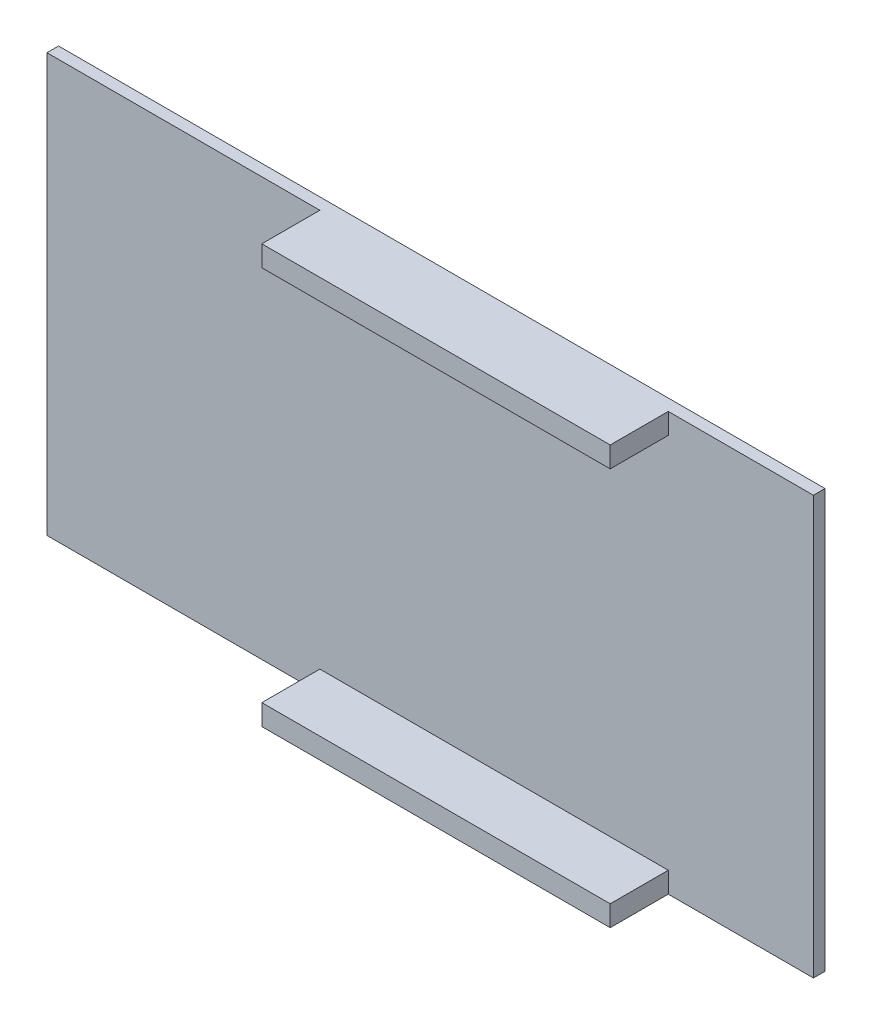
ISO-10303-21;
HEADER;
FILE_DESCRIPTION(('STEP AP214'),'2;1');
FILE_NAME('part.step','',(''),(''),'','','');
FILE_SCHEMA(('AUTOMOTIVE_DESIGN { 1 0 10303 214 1 1 1 1 }'));
ENDSEC;
DATA;
#1=APPLICATION_CONTEXT('core data for automotive mechanical design processes');
#2=APPLICATION_PROTOCOL_DEFINITION('international standard','automotive_design',2000,#1);
#3=PRODUCT_CONTEXT('',#1,'mechanical');
#4=PRODUCT('Part','Part','',(#3));
#5=PRODUCT_RELATED_PRODUCT_CATEGORY('part','',(#4));
#6=PRODUCT_DEFINITION_FORMATION('','',#4);
#7=PRODUCT_DEFINITION_CONTEXT('part definition',#1,'design');
#8=PRODUCT_DEFINITION('design','',#6,#7);
#9=PRODUCT_DEFINITION_SHAPE('','',#8);
#10=(LENGTH_UNIT() NAMED_UNIT(*) SI_UNIT(.MILLI.,.METRE.));
#11=(NAMED_UNIT(*) PLANE_ANGLE_UNIT() SI_UNIT($,.RADIAN.));
#12=(NAMED_UNIT(*) SI_UNIT($,.STERADIAN.) SOLID_ANGLE_UNIT());
#13=UNCERTAINTY_MEASURE_WITH_UNIT(LENGTH_MEASURE(1.E-05),#10,'distance_accuracy_value','');
#14=(GEOMETRIC_REPRESENTATION_CONTEXT(3) GLOBAL_UNCERTAINTY_ASSIGNED_CONTEXT((#13)) GLOBAL_UNIT_ASSIGNED_CONTEXT((#10,
#11,#12)) REPRESENTATION_CONTEXT('',''));
#15=CARTESIAN_POINT('',(0.,0.,0.));
#16=DIRECTION('',(0.,0.,1.));
#17=DIRECTION('',(1.,0.,0.));
#18=AXIS2_PLACEMENT_3D('',#15,#16,#17);
#19=CARTESIAN_POINT('',(0.,0.,2.));
#20=DIRECTION('',(0.,0.,-1.));
#21=DIRECTION('',(-1.,0.,0.));
#22=AXIS2_PLACEMENT_3D('',#19,#20,#21);
#23=PLANE('',#22);
#24=DIRECTION('',(1.,0.,0.));
#25=VECTOR('',#24,1.);
#26=CARTESIAN_POINT('',(-66.,-36.,2.));
#27=LINE('',#26,#25);
#28=CARTESIAN_POINT('',(-66.,-36.,2.));
#29=VERTEX_POINT('',#28);
#30=CARTESIAN_POINT('',(-19.,-36.,2.));
#31=VERTEX_POINT('',#30);
#32=EDGE_CURVE('E211',#29,#31,#27,.T.);
#33=ORIENTED_EDGE('',*,*,#32,.T.);
#34=DIRECTION('',(0.,1.,0.));
#35=VECTOR('',#34,1.);
#36=CARTESIAN_POINT('',(-19.,-36.,2.));
#37=LINE('',#36,#35);
#38=CARTESIAN_POINT('',(-19.,-32.4297746310813,2.));
#39=VERTEX_POINT('',#38);
#40=EDGE_CURVE('E55',#31,#39,#37,.T.);
#41=ORIENTED_EDGE('',*,*,#40,.T.);
#42=DIRECTION('',(1.,0.,0.));
#43=VECTOR('',#42,1.);
#44=CARTESIAN_POINT('',(-19.,-32.4297746310813,2.));
#45=LINE('',#44,#43);
#46=CARTESIAN_POINT('',(41.,-32.4297746310813,2.));
#47=VERTEX_POINT('',#46);
#48=EDGE_CURVE('E50',#39,#47,#45,.T.);
#49=ORIENTED_EDGE('',*,*,#48,.T.);
#50=DIRECTION('',(0.,-1.,0.));
#51=VECTOR('',#50,1.);
#52=CARTESIAN_POINT('',(41.,-36.,2.));
#53=LINE('',#52,#51);
#54=CARTESIAN_POINT('',(41.,-36.,2.));
#55=VERTEX_POINT('',#54);
#56=EDGE_CURVE('E153',#47,#55,#53,.T.);
#57=ORIENTED_EDGE('',*,*,#56,.T.);
#58=CARTESIAN_POINT('',(66.,-36.,2.));
#59=VERTEX_POINT('',#58);
#60=EDGE_CURVE('E210',#55,#59,#27,.T.);
#61=ORIENTED_EDGE('',*,*,#60,.T.);
#62=DIRECTION('',(0.,1.,0.));
#63=VECTOR('',#62,1.);
#64=CARTESIAN_POINT('',(66.,-36.,2.));
#65=LINE('',#64,#63);
#66=CARTESIAN_POINT('',(66.,36.,2.));
#67=VERTEX_POINT('',#66);
#68=EDGE_CURVE('E203',#59,#67,#65,.T.);
#69=ORIENTED_EDGE('',*,*,#68,.T.);
#70=DIRECTION('',(-1.,0.,0.));
#71=VECTOR('',#70,1.);
#72=CARTESIAN_POINT('',(-66.,36.,2.));
#73=LINE('',#72,#71);
#74=CARTESIAN_POINT('',(41.,36.,2.));
#75=VERTEX_POINT('',#74);
#76=EDGE_CURVE('E202',#67,#75,#73,.T.);
#77=ORIENTED_EDGE('',*,*,#76,.T.);
#78=DIRECTION('',(0.,1.,0.));
#79=VECTOR('',#78,1.);
#80=CARTESIAN_POINT('',(41.,36.,2.));
#81=LINE('',#80,#79);
#82=CARTESIAN_POINT('',(41.,32.4297746310813,2.));
#83=VERTEX_POINT('',#82);
#84=EDGE_CURVE('E164',#83,#75,#81,.T.);
#85=ORIENTED_EDGE('',*,*,#84,.F.);
#86=DIRECTION('',(1.,0.,0.));
#87=VECTOR('',#86,1.);
#88=CARTESIAN_POINT('',(-19.,32.4297746310813,2.));
#89=LINE('',#88,#87);
#90=CARTESIAN_POINT('',(-19.,32.4297746310813,2.));
#91=VERTEX_POINT('',#90);
#92=EDGE_CURVE('E171',#91,#83,#89,.T.);
#93=ORIENTED_EDGE('',*,*,#92,.F.);
#94=DIRECTION('',(0.,-1.,0.));
#95=VECTOR('',#94,1.);
#96=CARTESIAN_POINT('',(-19.,36.,2.));
#97=LINE('',#96,#95);
#98=CARTESIAN_POINT('',(-19.,36.,2.));
#99=VERTEX_POINT('',#98);
#100=EDGE_CURVE('E132',#99,#91,#97,.T.);
#101=ORIENTED_EDGE('',*,*,#100,.F.);
#102=CARTESIAN_POINT('',(-66.,36.,2.));
#103=VERTEX_POINT('',#102);
#104=EDGE_CURVE('E199',#99,#103,#73,.T.);
#105=ORIENTED_EDGE('',*,*,#104,.T.);
#106=DIRECTION('',(0.,-1.,0.));
#107=VECTOR('',#106,1.);
#108=CARTESIAN_POINT('',(-66.,-36.,2.));
#109=LINE('',#108,#107);
#110=EDGE_CURVE('E207',#103,#29,#109,.T.);
#111=ORIENTED_EDGE('',*,*,#110,.T.);
#112=EDGE_LOOP('',(#33,#41,#49,#57,#61,#69,#77,#85,#93,#101,#105,#111));
#113=FACE_BOUND('',#112,.T.);
#114=ADVANCED_FACE('F33',(#113),#23,.F.);
#115=CARTESIAN_POINT('',(66.,-36.,2.));
#116=DIRECTION('',(-1.,0.,0.));
#117=DIRECTION('',(0.,0.,1.));
#118=AXIS2_PLACEMENT_3D('',#115,#116,#117);
#119=PLANE('',#118);
#120=DIRECTION('',(0.,1.,0.));
#121=VECTOR('',#120,1.);
#122=CARTESIAN_POINT('',(66.,-36.,0.));
#123=LINE('',#122,#121);
#124=CARTESIAN_POINT('',(66.,-36.,0.));
#125=VERTEX_POINT('',#124);
#126=CARTESIAN_POINT('',(66.,36.,0.));
#127=VERTEX_POINT('',#126);
#128=EDGE_CURVE('E214',#125,#127,#123,.T.);
#129=ORIENTED_EDGE('',*,*,#128,.T.);
#130=DIRECTION('',(0.,0.,-1.));
#131=VECTOR('',#130,1.);
#132=CARTESIAN_POINT('',(66.,36.,2.));
#133=LINE('',#132,#131);
#134=EDGE_CURVE('E11',#67,#127,#133,.T.);
#135=ORIENTED_EDGE('',*,*,#134,.F.);
#136=ORIENTED_EDGE('',*,*,#68,.F.);
#137=DIRECTION('',(0.,0.,-1.));
#138=VECTOR('',#137,1.);
#139=CARTESIAN_POINT('',(66.,-36.,2.));
#140=LINE('',#139,#138);
#141=EDGE_CURVE('E213',#59,#125,#140,.T.);
#142=ORIENTED_EDGE('',*,*,#141,.T.);
#143=EDGE_LOOP('',(#129,#135,#136,#142));
#144=FACE_BOUND('',#143,.T.);
#145=ADVANCED_FACE('F35',(#144),#119,.F.);
#146=CARTESIAN_POINT('',(-66.,36.,2.));
#147=DIRECTION('',(0.,-1.,0.));
#148=DIRECTION('',(0.,0.,-1.));
#149=AXIS2_PLACEMENT_3D('',#146,#147,#148);
#150=PLANE('',#149);
#151=DIRECTION('',(-1.,0.,0.));
#152=VECTOR('',#151,1.);
#153=CARTESIAN_POINT('',(-66.,36.,0.));
#154=LINE('',#153,#152);
#155=CARTESIAN_POINT('',(-66.,36.,0.));
#156=VERTEX_POINT('',#155);
#157=EDGE_CURVE('E217',#127,#156,#154,.T.);
#158=ORIENTED_EDGE('',*,*,#157,.T.);
#159=DIRECTION('',(0.,0.,-1.));
#160=VECTOR('',#159,1.);
#161=CARTESIAN_POINT('',(-66.,36.,2.));
#162=LINE('',#161,#160);
#163=EDGE_CURVE('E42',#103,#156,#162,.T.);
#164=ORIENTED_EDGE('',*,*,#163,.F.);
#165=ORIENTED_EDGE('',*,*,#104,.F.);
#166=DIRECTION('',(0.,0.,-1.));
#167=VECTOR('',#166,1.);
#168=CARTESIAN_POINT('',(-19.,36.,12.));
#169=LINE('',#168,#167);
#170=CARTESIAN_POINT('',(-19.,36.,12.));
#171=VERTEX_POINT('',#170);
#172=EDGE_CURVE('E170',#171,#99,#169,.T.);
#173=ORIENTED_EDGE('',*,*,#172,.F.);
#174=DIRECTION('',(-1.,0.,0.));
#175=VECTOR('',#174,1.);
#176=CARTESIAN_POINT('',(-19.,36.,12.));
#177=LINE('',#176,#175);
#178=CARTESIAN_POINT('',(41.,36.,12.));
#179=VERTEX_POINT('',#178);
#180=EDGE_CURVE('E168',#179,#171,#177,.T.);
#181=ORIENTED_EDGE('',*,*,#180,.F.);
#182=DIRECTION('',(0.,0.,-1.));
#183=VECTOR('',#182,1.);
#184=CARTESIAN_POINT('',(41.,36.,12.));
#185=LINE('',#184,#183);
#186=EDGE_CURVE('E183',#179,#75,#185,.T.);
#187=ORIENTED_EDGE('',*,*,#186,.T.);
#188=ORIENTED_EDGE('',*,*,#76,.F.);
#189=ORIENTED_EDGE('',*,*,#134,.T.);
#190=EDGE_LOOP('',(#158,#164,#165,#173,#181,#187,#188,#189));
#191=FACE_BOUND('',#190,.T.);
#192=ADVANCED_FACE('F263',(#191),#150,.F.);
#193=CARTESIAN_POINT('',(-66.,-36.,2.));
#194=DIRECTION('',(1.,0.,0.));
#195=DIRECTION('',(0.,0.,-1.));
#196=AXIS2_PLACEMENT_3D('',#193,#194,#195);
#197=PLANE('',#196);
#198=DIRECTION('',(0.,-1.,0.));
#199=VECTOR('',#198,1.);
#200=CARTESIAN_POINT('',(-66.,-36.,0.));
#201=LINE('',#200,#199);
#202=CARTESIAN_POINT('',(-66.,-36.,0.));
#203=VERTEX_POINT('',#202);
#204=EDGE_CURVE('E219',#156,#203,#201,.T.);
#205=ORIENTED_EDGE('',*,*,#204,.T.);
#206=DIRECTION('',(0.,0.,-1.));
#207=VECTOR('',#206,1.);
#208=CARTESIAN_POINT('',(-66.,-36.,2.));
#209=LINE('',#208,#207);
#210=EDGE_CURVE('E225',#29,#203,#209,.T.);
#211=ORIENTED_EDGE('',*,*,#210,.F.);
#212=ORIENTED_EDGE('',*,*,#110,.F.);
#213=ORIENTED_EDGE('',*,*,#163,.T.);
#214=EDGE_LOOP('',(#205,#211,#212,#213));
#215=FACE_BOUND('',#214,.T.);
#216=ADVANCED_FACE('F233',(#215),#197,.F.);
#217=CARTESIAN_POINT('',(-66.,-36.,2.));
#218=DIRECTION('',(0.,1.,0.));
#219=DIRECTION('',(0.,0.,1.));
#220=AXIS2_PLACEMENT_3D('',#217,#218,#219);
#221=PLANE('',#220);
#222=DIRECTION('',(1.,0.,0.));
#223=VECTOR('',#222,1.);
#224=CARTESIAN_POINT('',(-66.,-36.,0.));
#225=LINE('',#224,#223);
#226=EDGE_CURVE('E221',#203,#125,#225,.T.);
#227=ORIENTED_EDGE('',*,*,#226,.T.);
#228=ORIENTED_EDGE('',*,*,#141,.F.);
#229=ORIENTED_EDGE('',*,*,#60,.F.);
#230=DIRECTION('',(0.,0.,-1.));
#231=VECTOR('',#230,1.);
#232=CARTESIAN_POINT('',(41.,-36.,12.));
#233=LINE('',#232,#231);
#234=CARTESIAN_POINT('',(41.,-36.,12.));
#235=VERTEX_POINT('',#234);
#236=EDGE_CURVE('E133',#235,#55,#233,.T.);
#237=ORIENTED_EDGE('',*,*,#236,.F.);
#238=DIRECTION('',(-1.,0.,0.));
#239=VECTOR('',#238,1.);
#240=CARTESIAN_POINT('',(-19.,-36.,12.));
#241=LINE('',#240,#239);
#242=CARTESIAN_POINT('',(-19.,-36.,12.));
#243=VERTEX_POINT('',#242);
#244=EDGE_CURVE('E139',#235,#243,#241,.T.);
#245=ORIENTED_EDGE('',*,*,#244,.T.);
#246=DIRECTION('',(0.,0.,-1.));
#247=VECTOR('',#246,1.);
#248=CARTESIAN_POINT('',(-19.,-36.,12.));
#249=LINE('',#248,#247);
#250=EDGE_CURVE('E124',#243,#31,#249,.T.);
#251=ORIENTED_EDGE('',*,*,#250,.T.);
#252=ORIENTED_EDGE('',*,*,#32,.F.);
#253=ORIENTED_EDGE('',*,*,#210,.T.);
#254=EDGE_LOOP('',(#227,#228,#229,#237,#245,#251,#252,#253));
#255=FACE_BOUND('',#254,.T.);
#256=ADVANCED_FACE('F144',(#255),#221,.F.);
#257=CARTESIAN_POINT('',(0.,0.,0.));
#258=DIRECTION('',(0.,0.,-1.));
#259=DIRECTION('',(-1.,0.,0.));
#260=AXIS2_PLACEMENT_3D('',#257,#258,#259);
#261=PLANE('',#260);
#262=ORIENTED_EDGE('',*,*,#128,.F.);
#263=ORIENTED_EDGE('',*,*,#226,.F.);
#264=ORIENTED_EDGE('',*,*,#204,.F.);
#265=ORIENTED_EDGE('',*,*,#157,.F.);
#266=EDGE_LOOP('',(#262,#263,#264,#265));
#267=FACE_BOUND('',#266,.T.);
#268=ADVANCED_FACE('F239',(#267),#261,.T.);
#269=CARTESIAN_POINT('',(-19.,36.,12.));
#270=DIRECTION('',(1.,0.,0.));
#271=DIRECTION('',(0.,1.,0.));
#272=AXIS2_PLACEMENT_3D('',#269,#270,#271);
#273=PLANE('',#272);
#274=ORIENTED_EDGE('',*,*,#100,.T.);
#275=DIRECTION('',(0.,0.,-1.));
#276=VECTOR('',#275,1.);
#277=CARTESIAN_POINT('',(-19.,32.4297746310813,12.));
#278=LINE('',#277,#276);
#279=CARTESIAN_POINT('',(-19.,32.4297746310813,12.));
#280=VERTEX_POINT('',#279);
#281=EDGE_CURVE('E189',#280,#91,#278,.T.);
#282=ORIENTED_EDGE('',*,*,#281,.F.);
#283=DIRECTION('',(0.,-1.,0.));
#284=VECTOR('',#283,1.);
#285=CARTESIAN_POINT('',(-19.,36.,12.));
#286=LINE('',#285,#284);
#287=EDGE_CURVE('E160',#171,#280,#286,.T.);
#288=ORIENTED_EDGE('',*,*,#287,.F.);
#289=ORIENTED_EDGE('',*,*,#172,.T.);
#290=EDGE_LOOP('',(#274,#282,#288,#289));
#291=FACE_BOUND('',#290,.T.);
#292=ADVANCED_FACE('F266',(#291),#273,.F.);
#293=CARTESIAN_POINT('',(-19.,32.4297746310813,12.));
#294=DIRECTION('',(0.,1.,0.));
#295=DIRECTION('',(-1.,0.,0.));
#296=AXIS2_PLACEMENT_3D('',#293,#294,#295);
#297=PLANE('',#296);
#298=ORIENTED_EDGE('',*,*,#92,.T.);
#299=DIRECTION('',(0.,0.,-1.));
#300=VECTOR('',#299,1.);
#301=CARTESIAN_POINT('',(41.,32.4297746310813,12.));
#302=LINE('',#301,#300);
#303=CARTESIAN_POINT('',(41.,32.4297746310813,12.));
#304=VERTEX_POINT('',#303);
#305=EDGE_CURVE('E176',#304,#83,#302,.T.);
#306=ORIENTED_EDGE('',*,*,#305,.F.);
#307=DIRECTION('',(1.,0.,0.));
#308=VECTOR('',#307,1.);
#309=CARTESIAN_POINT('',(-19.,32.4297746310813,12.));
#310=LINE('',#309,#308);
#311=EDGE_CURVE('E163',#280,#304,#310,.T.);
#312=ORIENTED_EDGE('',*,*,#311,.F.);
#313=ORIENTED_EDGE('',*,*,#281,.T.);
#314=EDGE_LOOP('',(#298,#306,#312,#313));
#315=FACE_BOUND('',#314,.T.);
#316=ADVANCED_FACE('F297',(#315),#297,.F.);
#317=CARTESIAN_POINT('',(41.,36.,12.));
#318=DIRECTION('',(-1.,0.,0.));
#319=DIRECTION('',(0.,0.,1.));
#320=AXIS2_PLACEMENT_3D('',#317,#318,#319);
#321=PLANE('',#320);
#322=ORIENTED_EDGE('',*,*,#84,.T.);
#323=ORIENTED_EDGE('',*,*,#186,.F.);
#324=DIRECTION('',(0.,1.,0.));
#325=VECTOR('',#324,1.);
#326=CARTESIAN_POINT('',(41.,36.,12.));
#327=LINE('',#326,#325);
#328=EDGE_CURVE('E166',#304,#179,#327,.T.);
#329=ORIENTED_EDGE('',*,*,#328,.F.);
#330=ORIENTED_EDGE('',*,*,#305,.T.);
#331=EDGE_LOOP('',(#322,#323,#329,#330));
#332=FACE_BOUND('',#331,.T.);
#333=ADVANCED_FACE('F303',(#332),#321,.F.);
#334=CARTESIAN_POINT('',(0.,0.,12.));
#335=DIRECTION('',(0.,0.,1.));
#336=DIRECTION('',(1.,0.,0.));
#337=AXIS2_PLACEMENT_3D('',#334,#335,#336);
#338=PLANE('',#337);
#339=ORIENTED_EDGE('',*,*,#287,.T.);
#340=ORIENTED_EDGE('',*,*,#311,.T.);
#341=ORIENTED_EDGE('',*,*,#328,.T.);
#342=ORIENTED_EDGE('',*,*,#180,.T.);
#343=EDGE_LOOP('',(#339,#340,#341,#342));
#344=FACE_BOUND('',#343,.T.);
#345=ADVANCED_FACE('F310',(#344),#338,.T.);
#346=CARTESIAN_POINT('',(-19.,-36.,12.));
#347=DIRECTION('',(-1.,0.,0.));
#348=DIRECTION('',(0.,-1.,0.));
#349=AXIS2_PLACEMENT_3D('',#346,#347,#348);
#350=PLANE('',#349);
#351=ORIENTED_EDGE('',*,*,#40,.F.);
#352=ORIENTED_EDGE('',*,*,#250,.F.);
#353=DIRECTION('',(0.,1.,0.));
#354=VECTOR('',#353,1.);
#355=CARTESIAN_POINT('',(-19.,-36.,12.));
#356=LINE('',#355,#354);
#357=CARTESIAN_POINT('',(-19.,-32.4297746310813,12.));
#358=VERTEX_POINT('',#357);
#359=EDGE_CURVE('E127',#243,#358,#356,.T.);
#360=ORIENTED_EDGE('',*,*,#359,.T.);
#361=DIRECTION('',(0.,0.,-1.));
#362=VECTOR('',#361,1.);
#363=CARTESIAN_POINT('',(-19.,-32.4297746310813,12.));
#364=LINE('',#363,#362);
#365=EDGE_CURVE('E151',#358,#39,#364,.T.);
#366=ORIENTED_EDGE('',*,*,#365,.T.);
#367=EDGE_LOOP('',(#351,#352,#360,#366));
#368=FACE_BOUND('',#367,.T.);
#369=ADVANCED_FACE('F126',(#368),#350,.T.);
#370=CARTESIAN_POINT('',(41.,-36.,12.));
#371=DIRECTION('',(1.,0.,0.));
#372=DIRECTION('',(0.,0.,-1.));
#373=AXIS2_PLACEMENT_3D('',#370,#371,#372);
#374=PLANE('',#373);
#375=ORIENTED_EDGE('',*,*,#56,.F.);
#376=DIRECTION('',(0.,0.,-1.));
#377=VECTOR('',#376,1.);
#378=CARTESIAN_POINT('',(41.,-32.4297746310813,12.));
#379=LINE('',#378,#377);
#380=CARTESIAN_POINT('',(41.,-32.4297746310813,12.));
#381=VERTEX_POINT('',#380);
#382=EDGE_CURVE('E157',#381,#47,#379,.T.);
#383=ORIENTED_EDGE('',*,*,#382,.F.);
#384=DIRECTION('',(0.,-1.,0.));
#385=VECTOR('',#384,1.);
#386=CARTESIAN_POINT('',(41.,-36.,12.));
#387=LINE('',#386,#385);
#388=EDGE_CURVE('E146',#381,#235,#387,.T.);
#389=ORIENTED_EDGE('',*,*,#388,.T.);
#390=ORIENTED_EDGE('',*,*,#236,.T.);
#391=EDGE_LOOP('',(#375,#383,#389,#390));
#392=FACE_BOUND('',#391,.T.);
#393=ADVANCED_FACE('F247',(#392),#374,.T.);
#394=CARTESIAN_POINT('',(-19.,-32.4297746310813,12.));
#395=DIRECTION('',(0.,1.,0.));
#396=DIRECTION('',(-1.,0.,0.));
#397=AXIS2_PLACEMENT_3D('',#394,#395,#396);
#398=PLANE('',#397);
#399=ORIENTED_EDGE('',*,*,#48,.F.);
#400=ORIENTED_EDGE('',*,*,#365,.F.);
#401=DIRECTION('',(1.,0.,0.));
#402=VECTOR('',#401,1.);
#403=CARTESIAN_POINT('',(-19.,-32.4297746310813,12.));
#404=LINE('',#403,#402);
#405=EDGE_CURVE('E142',#358,#381,#404,.T.);
#406=ORIENTED_EDGE('',*,*,#405,.T.);
#407=ORIENTED_EDGE('',*,*,#382,.T.);
#408=EDGE_LOOP('',(#399,#400,#406,#407));
#409=FACE_BOUND('',#408,.T.);
#410=ADVANCED_FACE('F249',(#409),#398,.T.);
#411=CARTESIAN_POINT('',(0.,0.,12.));
#412=DIRECTION('',(0.,0.,1.));
#413=DIRECTION('',(1.,0.,0.));
#414=AXIS2_PLACEMENT_3D('',#411,#412,#413);
#415=PLANE('',#414);
#416=ORIENTED_EDGE('',*,*,#359,.F.);
#417=ORIENTED_EDGE('',*,*,#244,.F.);
#418=ORIENTED_EDGE('',*,*,#388,.F.);
#419=ORIENTED_EDGE('',*,*,#405,.F.);
#420=EDGE_LOOP('',(#416,#417,#418,#419));
#421=FACE_BOUND('',#420,.T.);
#422=ADVANCED_FACE('F137',(#421),#415,.T.);
#423=CLOSED_SHELL('',(#114,#145,#192,#216,#256,#268,#292,#316,#333,#345,#369,#393,#410,#422));
#424=MANIFOLD_SOLID_BREP('B2',#423);
#425=ADVANCED_BREP_SHAPE_REPRESENTATION('',(#18,#424),#14);
#426=SHAPE_DEFINITION_REPRESENTATION(#9,#425);
ENDSEC;
END-ISO-10303-21;
